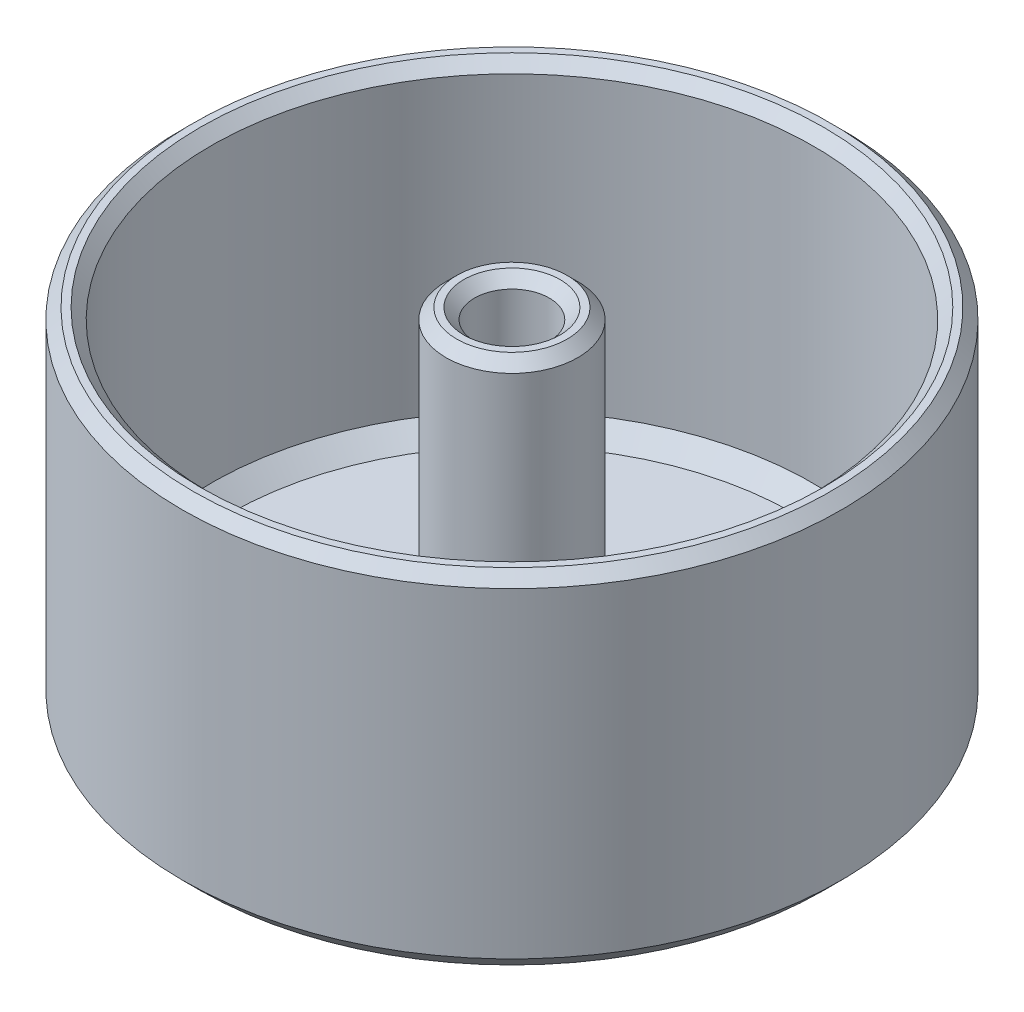
ISO-10303-21;
HEADER;
FILE_DESCRIPTION(('STEP AP214'),'2;1');
FILE_NAME('part.step','',(''),(''),'','','');
FILE_SCHEMA(('AUTOMOTIVE_DESIGN { 1 0 10303 214 1 1 1 1 }'));
ENDSEC;
DATA;
#1=APPLICATION_CONTEXT('core data for automotive mechanical design processes');
#2=APPLICATION_PROTOCOL_DEFINITION('international standard','automotive_design',2000,#1);
#3=PRODUCT_CONTEXT('',#1,'mechanical');
#4=PRODUCT('Part','Part','',(#3));
#5=PRODUCT_RELATED_PRODUCT_CATEGORY('part','',(#4));
#6=PRODUCT_DEFINITION_FORMATION('','',#4);
#7=PRODUCT_DEFINITION_CONTEXT('part definition',#1,'design');
#8=PRODUCT_DEFINITION('design','',#6,#7);
#9=PRODUCT_DEFINITION_SHAPE('','',#8);
#10=(LENGTH_UNIT() NAMED_UNIT(*) SI_UNIT(.MILLI.,.METRE.));
#11=(NAMED_UNIT(*) PLANE_ANGLE_UNIT() SI_UNIT($,.RADIAN.));
#12=(NAMED_UNIT(*) SI_UNIT($,.STERADIAN.) SOLID_ANGLE_UNIT());
#13=UNCERTAINTY_MEASURE_WITH_UNIT(LENGTH_MEASURE(1.E-05),#10,'distance_accuracy_value','');
#14=(GEOMETRIC_REPRESENTATION_CONTEXT(3) GLOBAL_UNCERTAINTY_ASSIGNED_CONTEXT((#13)) GLOBAL_UNIT_ASSIGNED_CONTEXT((#10,
#11,#12)) REPRESENTATION_CONTEXT('',''));
#15=CARTESIAN_POINT('',(0.,0.,0.));
#16=DIRECTION('',(0.,0.,1.));
#17=DIRECTION('',(1.,0.,0.));
#18=AXIS2_PLACEMENT_3D('',#15,#16,#17);
#19=CARTESIAN_POINT('',(0.,-24.1,0.));
#20=DIRECTION('',(0.,1.,0.));
#21=DIRECTION('',(0.,0.,1.));
#22=AXIS2_PLACEMENT_3D('',#19,#20,#21);
#23=CONICAL_SURFACE('',#22,46.25,0.78539816339745);
#24=CARTESIAN_POINT('',(0.,-26.6,0.));
#25=DIRECTION('',(0.,1.,0.));
#26=DIRECTION('',(0.,0.,1.));
#27=AXIS2_PLACEMENT_3D('',#24,#25,#26);
#28=CIRCLE('',#27,43.75);
#29=CARTESIAN_POINT('',(0.,-26.6,43.75));
#30=VERTEX_POINT('',#29);
#31=EDGE_CURVE('E10',#30,#30,#28,.T.);
#32=ORIENTED_EDGE('',*,*,#31,.T.);
#33=EDGE_LOOP('',(#32));
#34=FACE_BOUND('',#33,.T.);
#35=CARTESIAN_POINT('',(0.,-24.1,0.));
#36=DIRECTION('',(0.,1.,0.));
#37=DIRECTION('',(0.,0.,1.));
#38=AXIS2_PLACEMENT_3D('',#35,#36,#37);
#39=CIRCLE('',#38,46.25);
#40=CARTESIAN_POINT('',(0.,-24.1,46.25));
#41=VERTEX_POINT('',#40);
#42=EDGE_CURVE('E86',#41,#41,#39,.T.);
#43=ORIENTED_EDGE('',*,*,#42,.F.);
#44=EDGE_LOOP('',(#43));
#45=FACE_BOUND('',#44,.T.);
#46=ADVANCED_FACE('F34',(#34,#45),#23,.T.);
#47=CARTESIAN_POINT('',(0.,-26.6,43.75));
#48=DIRECTION('',(0.,-1.,0.));
#49=DIRECTION('',(0.,0.,-1.));
#50=AXIS2_PLACEMENT_3D('',#47,#48,#49);
#51=PLANE('',#50);
#52=CARTESIAN_POINT('',(0.,-26.6,0.));
#53=DIRECTION('',(0.,1.,0.));
#54=DIRECTION('',(0.,0.,1.));
#55=AXIS2_PLACEMENT_3D('',#52,#53,#54);
#56=CIRCLE('',#55,7.75);
#57=CARTESIAN_POINT('',(0.,-26.6,7.75));
#58=VERTEX_POINT('',#57);
#59=EDGE_CURVE('E40',#58,#58,#56,.T.);
#60=ORIENTED_EDGE('',*,*,#59,.T.);
#61=EDGE_LOOP('',(#60));
#62=FACE_BOUND('',#61,.T.);
#63=ORIENTED_EDGE('',*,*,#31,.F.);
#64=EDGE_LOOP('',(#63));
#65=FACE_BOUND('',#64,.T.);
#66=ADVANCED_FACE('F94',(#62,#65),#51,.T.);
#67=CARTESIAN_POINT('',(0.,-26.6,0.));
#68=DIRECTION('',(0.,-1.,0.));
#69=DIRECTION('',(0.,0.,-1.));
#70=AXIS2_PLACEMENT_3D('',#67,#68,#69);
#71=CONICAL_SURFACE('',#70,7.75,0.785398163397448);
#72=CARTESIAN_POINT('',(0.,-24.1,0.));
#73=DIRECTION('',(0.,1.,0.));
#74=DIRECTION('',(0.,0.,1.));
#75=AXIS2_PLACEMENT_3D('',#72,#73,#74);
#76=CIRCLE('',#75,5.25);
#77=CARTESIAN_POINT('',(0.,-24.1,5.25));
#78=VERTEX_POINT('',#77);
#79=EDGE_CURVE('E44',#78,#78,#76,.T.);
#80=ORIENTED_EDGE('',*,*,#79,.T.);
#81=EDGE_LOOP('',(#80));
#82=FACE_BOUND('',#81,.T.);
#83=ORIENTED_EDGE('',*,*,#59,.F.);
#84=EDGE_LOOP('',(#83));
#85=FACE_BOUND('',#84,.T.);
#86=ADVANCED_FACE('F98',(#82,#85),#71,.F.);
#87=CARTESIAN_POINT('',(0.,44.5664773015121,0.));
#88=DIRECTION('',(0.,1.,0.));
#89=DIRECTION('',(0.,0.,1.));
#90=AXIS2_PLACEMENT_3D('',#87,#88,#89);
#91=CYLINDRICAL_SURFACE('',#90,5.25);
#92=CARTESIAN_POINT('',(0.,20.9,0.));
#93=DIRECTION('',(0.,1.,0.));
#94=DIRECTION('',(0.,0.,1.));
#95=AXIS2_PLACEMENT_3D('',#92,#93,#94);
#96=CIRCLE('',#95,5.25);
#97=CARTESIAN_POINT('',(0.,20.9,5.25));
#98=VERTEX_POINT('',#97);
#99=EDGE_CURVE('E48',#98,#98,#96,.T.);
#100=ORIENTED_EDGE('',*,*,#99,.T.);
#101=EDGE_LOOP('',(#100));
#102=FACE_BOUND('',#101,.T.);
#103=ORIENTED_EDGE('',*,*,#79,.F.);
#104=EDGE_LOOP('',(#103));
#105=FACE_BOUND('',#104,.T.);
#106=ADVANCED_FACE('F102',(#102,#105),#91,.F.);
#107=CARTESIAN_POINT('',(0.,20.9,0.));
#108=DIRECTION('',(0.,1.,0.));
#109=DIRECTION('',(0.,0.,1.));
#110=AXIS2_PLACEMENT_3D('',#107,#108,#109);
#111=CONICAL_SURFACE('',#110,5.25,0.785398163397449);
#112=CARTESIAN_POINT('',(0.,22.4,0.));
#113=DIRECTION('',(0.,1.,0.));
#114=DIRECTION('',(0.,0.,1.));
#115=AXIS2_PLACEMENT_3D('',#112,#113,#114);
#116=CIRCLE('',#115,6.75);
#117=CARTESIAN_POINT('',(0.,22.4,6.75));
#118=VERTEX_POINT('',#117);
#119=EDGE_CURVE('E53',#118,#118,#116,.T.);
#120=ORIENTED_EDGE('',*,*,#119,.T.);
#121=EDGE_LOOP('',(#120));
#122=FACE_BOUND('',#121,.T.);
#123=ORIENTED_EDGE('',*,*,#99,.F.);
#124=EDGE_LOOP('',(#123));
#125=FACE_BOUND('',#124,.T.);
#126=ADVANCED_FACE('F109',(#122,#125),#111,.F.);
#127=CARTESIAN_POINT('',(0.,22.4,6.75));
#128=DIRECTION('',(0.,1.,0.));
#129=DIRECTION('',(0.,0.,1.));
#130=AXIS2_PLACEMENT_3D('',#127,#128,#129);
#131=PLANE('',#130);
#132=CARTESIAN_POINT('',(0.,22.4,0.));
#133=DIRECTION('',(0.,1.,0.));
#134=DIRECTION('',(0.,0.,1.));
#135=AXIS2_PLACEMENT_3D('',#132,#133,#134);
#136=CIRCLE('',#135,7.74999999999999);
#137=CARTESIAN_POINT('',(0.,22.4,7.74999999999999));
#138=VERTEX_POINT('',#137);
#139=EDGE_CURVE('E56',#138,#138,#136,.T.);
#140=ORIENTED_EDGE('',*,*,#139,.T.);
#141=EDGE_LOOP('',(#140));
#142=FACE_BOUND('',#141,.T.);
#143=ORIENTED_EDGE('',*,*,#119,.F.);
#144=EDGE_LOOP('',(#143));
#145=FACE_BOUND('',#144,.T.);
#146=ADVANCED_FACE('F113',(#142,#145),#131,.T.);
#147=CARTESIAN_POINT('',(0.,22.4,0.));
#148=DIRECTION('',(0.,-1.,0.));
#149=DIRECTION('',(0.,0.,-1.));
#150=AXIS2_PLACEMENT_3D('',#147,#148,#149);
#151=CONICAL_SURFACE('',#150,7.74999999999999,0.785398163397447);
#152=CARTESIAN_POINT('',(0.,20.9,0.));
#153=DIRECTION('',(0.,1.,0.));
#154=DIRECTION('',(0.,0.,1.));
#155=AXIS2_PLACEMENT_3D('',#152,#153,#154);
#156=CIRCLE('',#155,9.24999999999999);
#157=CARTESIAN_POINT('',(0.,20.9,9.24999999999999));
#158=VERTEX_POINT('',#157);
#159=EDGE_CURVE('E59',#158,#158,#156,.T.);
#160=ORIENTED_EDGE('',*,*,#159,.T.);
#161=EDGE_LOOP('',(#160));
#162=FACE_BOUND('',#161,.T.);
#163=ORIENTED_EDGE('',*,*,#139,.F.);
#164=EDGE_LOOP('',(#163));
#165=FACE_BOUND('',#164,.T.);
#166=ADVANCED_FACE('F117',(#162,#165),#151,.T.);
#167=CARTESIAN_POINT('',(0.,44.5664773015121,0.));
#168=DIRECTION('',(0.,1.,0.));
#169=DIRECTION('',(0.,0.,1.));
#170=AXIS2_PLACEMENT_3D('',#167,#168,#169);
#171=CYLINDRICAL_SURFACE('',#170,9.24999999999999);
#172=CARTESIAN_POINT('',(0.,-20.1,0.));
#173=DIRECTION('',(0.,1.,0.));
#174=DIRECTION('',(0.,0.,1.));
#175=AXIS2_PLACEMENT_3D('',#172,#173,#174);
#176=CIRCLE('',#175,9.24999999999999);
#177=CARTESIAN_POINT('',(0.,-20.1,9.24999999999999));
#178=VERTEX_POINT('',#177);
#179=EDGE_CURVE('E62',#178,#178,#176,.T.);
#180=ORIENTED_EDGE('',*,*,#179,.T.);
#181=EDGE_LOOP('',(#180));
#182=FACE_BOUND('',#181,.T.);
#183=ORIENTED_EDGE('',*,*,#159,.F.);
#184=EDGE_LOOP('',(#183));
#185=FACE_BOUND('',#184,.T.);
#186=ADVANCED_FACE('F121',(#182,#185),#171,.T.);
#187=CARTESIAN_POINT('',(0.,-20.1,0.));
#188=DIRECTION('',(0.,-1.,0.));
#189=DIRECTION('',(0.,0.,-1.));
#190=AXIS2_PLACEMENT_3D('',#187,#188,#189);
#191=CONICAL_SURFACE('',#190,9.24999999999999,0.785398163397448);
#192=CARTESIAN_POINT('',(0.,-22.6,0.));
#193=DIRECTION('',(0.,1.,0.));
#194=DIRECTION('',(0.,0.,1.));
#195=AXIS2_PLACEMENT_3D('',#192,#193,#194);
#196=CIRCLE('',#195,11.75);
#197=CARTESIAN_POINT('',(0.,-22.6,11.75));
#198=VERTEX_POINT('',#197);
#199=EDGE_CURVE('E65',#198,#198,#196,.T.);
#200=ORIENTED_EDGE('',*,*,#199,.T.);
#201=EDGE_LOOP('',(#200));
#202=FACE_BOUND('',#201,.T.);
#203=ORIENTED_EDGE('',*,*,#179,.F.);
#204=EDGE_LOOP('',(#203));
#205=FACE_BOUND('',#204,.T.);
#206=ADVANCED_FACE('F125',(#202,#205),#191,.T.);
#207=CARTESIAN_POINT('',(0.,-22.6,39.75));
#208=DIRECTION('',(0.,1.,0.));
#209=DIRECTION('',(0.,0.,1.));
#210=AXIS2_PLACEMENT_3D('',#207,#208,#209);
#211=PLANE('',#210);
#212=CARTESIAN_POINT('',(0.,-22.6,0.));
#213=DIRECTION('',(0.,1.,0.));
#214=DIRECTION('',(0.,0.,1.));
#215=AXIS2_PLACEMENT_3D('',#212,#213,#214);
#216=CIRCLE('',#215,39.75);
#217=CARTESIAN_POINT('',(0.,-22.6,39.75));
#218=VERTEX_POINT('',#217);
#219=EDGE_CURVE('E68',#218,#218,#216,.T.);
#220=ORIENTED_EDGE('',*,*,#219,.T.);
#221=EDGE_LOOP('',(#220));
#222=FACE_BOUND('',#221,.T.);
#223=ORIENTED_EDGE('',*,*,#199,.F.);
#224=EDGE_LOOP('',(#223));
#225=FACE_BOUND('',#224,.T.);
#226=ADVANCED_FACE('F129',(#222,#225),#211,.T.);
#227=CARTESIAN_POINT('',(0.,-22.6,0.));
#228=DIRECTION('',(0.,1.,0.));
#229=DIRECTION('',(0.,0.,1.));
#230=AXIS2_PLACEMENT_3D('',#227,#228,#229);
#231=CONICAL_SURFACE('',#230,39.75,0.785398163397447);
#232=CARTESIAN_POINT('',(0.,-20.1,0.));
#233=DIRECTION('',(0.,1.,0.));
#234=DIRECTION('',(0.,0.,1.));
#235=AXIS2_PLACEMENT_3D('',#232,#233,#234);
#236=CIRCLE('',#235,42.25);
#237=CARTESIAN_POINT('',(0.,-20.1,42.25));
#238=VERTEX_POINT('',#237);
#239=EDGE_CURVE('E71',#238,#238,#236,.T.);
#240=ORIENTED_EDGE('',*,*,#239,.T.);
#241=EDGE_LOOP('',(#240));
#242=FACE_BOUND('',#241,.T.);
#243=ORIENTED_EDGE('',*,*,#219,.F.);
#244=EDGE_LOOP('',(#243));
#245=FACE_BOUND('',#244,.T.);
#246=ADVANCED_FACE('F133',(#242,#245),#231,.F.);
#247=CARTESIAN_POINT('',(0.,44.5664773015121,0.));
#248=DIRECTION('',(0.,1.,0.));
#249=DIRECTION('',(0.,0.,1.));
#250=AXIS2_PLACEMENT_3D('',#247,#248,#249);
#251=CYLINDRICAL_SURFACE('',#250,42.25);
#252=CARTESIAN_POINT('',(0.,20.9,0.));
#253=DIRECTION('',(0.,1.,0.));
#254=DIRECTION('',(0.,0.,1.));
#255=AXIS2_PLACEMENT_3D('',#252,#253,#254);
#256=CIRCLE('',#255,42.25);
#257=CARTESIAN_POINT('',(0.,20.9,42.25));
#258=VERTEX_POINT('',#257);
#259=EDGE_CURVE('E74',#258,#258,#256,.T.);
#260=ORIENTED_EDGE('',*,*,#259,.T.);
#261=EDGE_LOOP('',(#260));
#262=FACE_BOUND('',#261,.T.);
#263=ORIENTED_EDGE('',*,*,#239,.F.);
#264=EDGE_LOOP('',(#263));
#265=FACE_BOUND('',#264,.T.);
#266=ADVANCED_FACE('F137',(#262,#265),#251,.F.);
#267=CARTESIAN_POINT('',(0.,20.9,0.));
#268=DIRECTION('',(0.,1.,0.));
#269=DIRECTION('',(0.,0.,1.));
#270=AXIS2_PLACEMENT_3D('',#267,#268,#269);
#271=CONICAL_SURFACE('',#270,42.25,0.785398163397448);
#272=CARTESIAN_POINT('',(0.,22.4,0.));
#273=DIRECTION('',(0.,1.,0.));
#274=DIRECTION('',(0.,0.,1.));
#275=AXIS2_PLACEMENT_3D('',#272,#273,#274);
#276=CIRCLE('',#275,43.75);
#277=CARTESIAN_POINT('',(0.,22.4,43.75));
#278=VERTEX_POINT('',#277);
#279=EDGE_CURVE('E77',#278,#278,#276,.T.);
#280=ORIENTED_EDGE('',*,*,#279,.T.);
#281=EDGE_LOOP('',(#280));
#282=FACE_BOUND('',#281,.T.);
#283=ORIENTED_EDGE('',*,*,#259,.F.);
#284=EDGE_LOOP('',(#283));
#285=FACE_BOUND('',#284,.T.);
#286=ADVANCED_FACE('F141',(#282,#285),#271,.F.);
#287=CARTESIAN_POINT('',(0.,22.4,43.75));
#288=DIRECTION('',(0.,1.,0.));
#289=DIRECTION('',(0.,0.,1.));
#290=AXIS2_PLACEMENT_3D('',#287,#288,#289);
#291=PLANE('',#290);
#292=CARTESIAN_POINT('',(0.,22.4,0.));
#293=DIRECTION('',(0.,1.,0.));
#294=DIRECTION('',(0.,0.,1.));
#295=AXIS2_PLACEMENT_3D('',#292,#293,#294);
#296=CIRCLE('',#295,44.75);
#297=CARTESIAN_POINT('',(0.,22.4,44.75));
#298=VERTEX_POINT('',#297);
#299=EDGE_CURVE('E80',#298,#298,#296,.T.);
#300=ORIENTED_EDGE('',*,*,#299,.T.);
#301=EDGE_LOOP('',(#300));
#302=FACE_BOUND('',#301,.T.);
#303=ORIENTED_EDGE('',*,*,#279,.F.);
#304=EDGE_LOOP('',(#303));
#305=FACE_BOUND('',#304,.T.);
#306=ADVANCED_FACE('F145',(#302,#305),#291,.T.);
#307=CARTESIAN_POINT('',(0.,22.4,0.));
#308=DIRECTION('',(0.,-1.,0.));
#309=DIRECTION('',(0.,0.,-1.));
#310=AXIS2_PLACEMENT_3D('',#307,#308,#309);
#311=CONICAL_SURFACE('',#310,44.75,0.785398163397448);
#312=CARTESIAN_POINT('',(0.,20.9,0.));
#313=DIRECTION('',(0.,1.,0.));
#314=DIRECTION('',(0.,0.,1.));
#315=AXIS2_PLACEMENT_3D('',#312,#313,#314);
#316=CIRCLE('',#315,46.25);
#317=CARTESIAN_POINT('',(0.,20.9,46.25));
#318=VERTEX_POINT('',#317);
#319=EDGE_CURVE('E83',#318,#318,#316,.T.);
#320=ORIENTED_EDGE('',*,*,#319,.T.);
#321=EDGE_LOOP('',(#320));
#322=FACE_BOUND('',#321,.T.);
#323=ORIENTED_EDGE('',*,*,#299,.F.);
#324=EDGE_LOOP('',(#323));
#325=FACE_BOUND('',#324,.T.);
#326=ADVANCED_FACE('F149',(#322,#325),#311,.T.);
#327=CARTESIAN_POINT('',(0.,44.5664773015121,0.));
#328=DIRECTION('',(0.,1.,0.));
#329=DIRECTION('',(0.,0.,1.));
#330=AXIS2_PLACEMENT_3D('',#327,#328,#329);
#331=CYLINDRICAL_SURFACE('',#330,46.25);
#332=ORIENTED_EDGE('',*,*,#42,.T.);
#333=EDGE_LOOP('',(#332));
#334=FACE_BOUND('',#333,.T.);
#335=ORIENTED_EDGE('',*,*,#319,.F.);
#336=EDGE_LOOP('',(#335));
#337=FACE_BOUND('',#336,.T.);
#338=ADVANCED_FACE('F90',(#334,#337),#331,.T.);
#339=CLOSED_SHELL('',(#46,#66,#86,#106,#126,#146,#166,#186,#206,#226,#246,#266,#286,#306,#326,#338));
#340=MANIFOLD_SOLID_BREP('B2',#339);
#341=ADVANCED_BREP_SHAPE_REPRESENTATION('',(#18,#340),#14);
#342=SHAPE_DEFINITION_REPRESENTATION(#9,#341);
ENDSEC;
END-ISO-10303-21;
